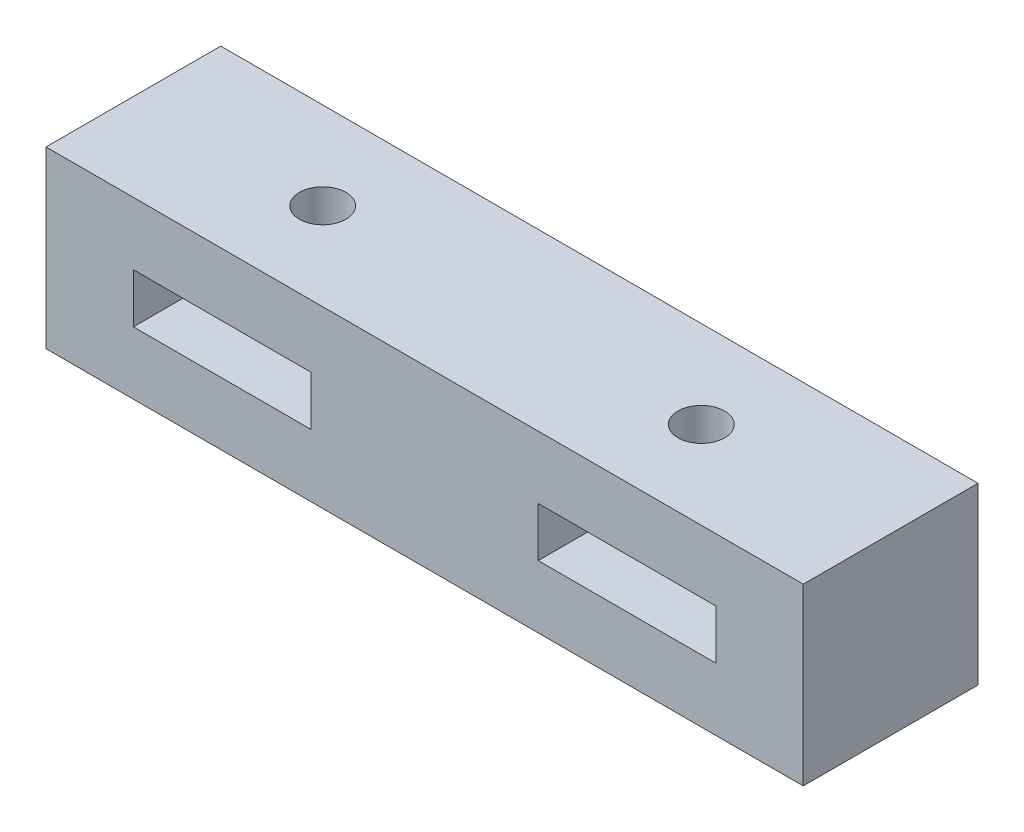
ISO-10303-21;
HEADER;
FILE_DESCRIPTION(('STEP AP214'),'2;1');
FILE_NAME('part.step','',(''),(''),'','','');
FILE_SCHEMA(('AUTOMOTIVE_DESIGN { 1 0 10303 214 1 1 1 1 }'));
ENDSEC;
DATA;
#1=APPLICATION_CONTEXT('core data for automotive mechanical design processes');
#2=APPLICATION_PROTOCOL_DEFINITION('international standard','automotive_design',2000,#1);
#3=PRODUCT_CONTEXT('',#1,'mechanical');
#4=PRODUCT('Part','Part','',(#3));
#5=PRODUCT_RELATED_PRODUCT_CATEGORY('part','',(#4));
#6=PRODUCT_DEFINITION_FORMATION('','',#4);
#7=PRODUCT_DEFINITION_CONTEXT('part definition',#1,'design');
#8=PRODUCT_DEFINITION('design','',#6,#7);
#9=PRODUCT_DEFINITION_SHAPE('','',#8);
#10=(LENGTH_UNIT() NAMED_UNIT(*) SI_UNIT(.MILLI.,.METRE.));
#11=(NAMED_UNIT(*) PLANE_ANGLE_UNIT() SI_UNIT($,.RADIAN.));
#12=(NAMED_UNIT(*) SI_UNIT($,.STERADIAN.) SOLID_ANGLE_UNIT());
#13=UNCERTAINTY_MEASURE_WITH_UNIT(LENGTH_MEASURE(1.E-05),#10,'distance_accuracy_value','');
#14=(GEOMETRIC_REPRESENTATION_CONTEXT(3) GLOBAL_UNCERTAINTY_ASSIGNED_CONTEXT((#13)) GLOBAL_UNIT_ASSIGNED_CONTEXT((#10,
#11,#12)) REPRESENTATION_CONTEXT('',''));
#15=CARTESIAN_POINT('',(0.,0.,0.));
#16=DIRECTION('',(0.,0.,1.));
#17=DIRECTION('',(1.,0.,0.));
#18=AXIS2_PLACEMENT_3D('',#15,#16,#17);
#19=CARTESIAN_POINT('',(0.,0.,6.));
#20=DIRECTION('',(0.,0.,-1.));
#21=DIRECTION('',(-1.,0.,0.));
#22=AXIS2_PLACEMENT_3D('',#19,#20,#21);
#23=PLANE('',#22);
#24=DIRECTION('',(0.,1.,0.));
#25=VECTOR('',#24,1.);
#26=CARTESIAN_POINT('',(-7.8,-1.7,6.));
#27=LINE('',#26,#25);
#28=CARTESIAN_POINT('',(-7.8,-1.7,6.));
#29=VERTEX_POINT('',#28);
#30=CARTESIAN_POINT('',(-7.8,1.7,6.));
#31=VERTEX_POINT('',#30);
#32=EDGE_CURVE('E166',#29,#31,#27,.T.);
#33=ORIENTED_EDGE('',*,*,#32,.F.);
#34=DIRECTION('',(1.,0.,0.));
#35=VECTOR('',#34,1.);
#36=CARTESIAN_POINT('',(-20.,-1.7,6.));
#37=LINE('',#36,#35);
#38=CARTESIAN_POINT('',(-20.,-1.7,6.));
#39=VERTEX_POINT('',#38);
#40=EDGE_CURVE('E174',#39,#29,#37,.T.);
#41=ORIENTED_EDGE('',*,*,#40,.F.);
#42=DIRECTION('',(0.,-1.,0.));
#43=VECTOR('',#42,1.);
#44=CARTESIAN_POINT('',(-20.,-1.7,6.));
#45=LINE('',#44,#43);
#46=CARTESIAN_POINT('',(-20.,1.7,6.));
#47=VERTEX_POINT('',#46);
#48=EDGE_CURVE('E171',#47,#39,#45,.T.);
#49=ORIENTED_EDGE('',*,*,#48,.F.);
#50=DIRECTION('',(-1.,0.,0.));
#51=VECTOR('',#50,1.);
#52=CARTESIAN_POINT('',(-20.,1.7,6.));
#53=LINE('',#52,#51);
#54=EDGE_CURVE('E168',#31,#47,#53,.T.);
#55=ORIENTED_EDGE('',*,*,#54,.F.);
#56=EDGE_LOOP('',(#33,#41,#49,#55));
#57=FACE_BOUND('',#56,.T.);
#58=DIRECTION('',(0.,1.,0.));
#59=VECTOR('',#58,1.);
#60=CARTESIAN_POINT('',(26.,-6.,6.));
#61=LINE('',#60,#59);
#62=CARTESIAN_POINT('',(26.,-6.,6.));
#63=VERTEX_POINT('',#62);
#64=CARTESIAN_POINT('',(26.,6.,6.));
#65=VERTEX_POINT('',#64);
#66=EDGE_CURVE('E197',#63,#65,#61,.T.);
#67=ORIENTED_EDGE('',*,*,#66,.T.);
#68=DIRECTION('',(-1.,0.,0.));
#69=VECTOR('',#68,1.);
#70=CARTESIAN_POINT('',(-26.,5.99999999999999,6.));
#71=LINE('',#70,#69);
#72=CARTESIAN_POINT('',(-26.,5.99999999999999,6.));
#73=VERTEX_POINT('',#72);
#74=EDGE_CURVE('E200',#65,#73,#71,.T.);
#75=ORIENTED_EDGE('',*,*,#74,.T.);
#76=DIRECTION('',(0.,-1.,0.));
#77=VECTOR('',#76,1.);
#78=CARTESIAN_POINT('',(-26.,-6.00000000000001,6.));
#79=LINE('',#78,#77);
#80=CARTESIAN_POINT('',(-26.,-6.00000000000001,6.));
#81=VERTEX_POINT('',#80);
#82=EDGE_CURVE('E203',#73,#81,#79,.T.);
#83=ORIENTED_EDGE('',*,*,#82,.T.);
#84=DIRECTION('',(1.,0.,0.));
#85=VECTOR('',#84,1.);
#86=CARTESIAN_POINT('',(-26.,-6.00000000000001,6.));
#87=LINE('',#86,#85);
#88=EDGE_CURVE('E205',#81,#63,#87,.T.);
#89=ORIENTED_EDGE('',*,*,#88,.T.);
#90=EDGE_LOOP('',(#67,#75,#83,#89));
#91=FACE_BOUND('',#90,.T.);
#92=DIRECTION('',(0.,1.,0.));
#93=VECTOR('',#92,1.);
#94=CARTESIAN_POINT('',(20.,-1.69999999999999,6.));
#95=LINE('',#94,#93);
#96=CARTESIAN_POINT('',(20.,-1.69999999999999,6.));
#97=VERTEX_POINT('',#96);
#98=CARTESIAN_POINT('',(20.,1.70000000000001,6.));
#99=VERTEX_POINT('',#98);
#100=EDGE_CURVE('E128',#97,#99,#95,.T.);
#101=ORIENTED_EDGE('',*,*,#100,.F.);
#102=DIRECTION('',(1.,0.,0.));
#103=VECTOR('',#102,1.);
#104=CARTESIAN_POINT('',(20.,-1.69999999999999,6.));
#105=LINE('',#104,#103);
#106=CARTESIAN_POINT('',(7.8,-1.7,6.));
#107=VERTEX_POINT('',#106);
#108=EDGE_CURVE('E150',#107,#97,#105,.T.);
#109=ORIENTED_EDGE('',*,*,#108,.F.);
#110=DIRECTION('',(0.,-1.,0.));
#111=VECTOR('',#110,1.);
#112=CARTESIAN_POINT('',(7.8,-1.7,6.));
#113=LINE('',#112,#111);
#114=CARTESIAN_POINT('',(7.8,1.7,6.));
#115=VERTEX_POINT('',#114);
#116=EDGE_CURVE('E148',#115,#107,#113,.T.);
#117=ORIENTED_EDGE('',*,*,#116,.F.);
#118=DIRECTION('',(-1.,0.,0.));
#119=VECTOR('',#118,1.);
#120=CARTESIAN_POINT('',(20.,1.70000000000001,6.));
#121=LINE('',#120,#119);
#122=EDGE_CURVE('E136',#99,#115,#121,.T.);
#123=ORIENTED_EDGE('',*,*,#122,.F.);
#124=EDGE_LOOP('',(#101,#109,#117,#123));
#125=FACE_BOUND('',#124,.T.);
#126=ADVANCED_FACE('F37',(#57,#91,#125),#23,.F.);
#127=CARTESIAN_POINT('',(0.,0.,-6.));
#128=DIRECTION('',(0.,0.,-1.));
#129=DIRECTION('',(-1.,0.,0.));
#130=AXIS2_PLACEMENT_3D('',#127,#128,#129);
#131=PLANE('',#130);
#132=CARTESIAN_POINT('',(0.,0.,-6.));
#133=DIRECTION('',(0.,0.,-1.));
#134=DIRECTION('',(-1.,0.,0.));
#135=AXIS2_PLACEMENT_3D('',#132,#133,#134);
#136=CIRCLE('',#135,4.15);
#137=CARTESIAN_POINT('',(-4.15,0.,-6.));
#138=VERTEX_POINT('',#137);
#139=EDGE_CURVE('E246',#138,#138,#136,.T.);
#140=ORIENTED_EDGE('',*,*,#139,.F.);
#141=EDGE_LOOP('',(#140));
#142=FACE_BOUND('',#141,.T.);
#143=DIRECTION('',(0.,1.,0.));
#144=VECTOR('',#143,1.);
#145=CARTESIAN_POINT('',(26.,-6.,-6.));
#146=LINE('',#145,#144);
#147=CARTESIAN_POINT('',(26.,-6.,-6.));
#148=VERTEX_POINT('',#147);
#149=CARTESIAN_POINT('',(26.,6.,-6.));
#150=VERTEX_POINT('',#149);
#151=EDGE_CURVE('E196',#148,#150,#146,.T.);
#152=ORIENTED_EDGE('',*,*,#151,.F.);
#153=DIRECTION('',(1.,0.,0.));
#154=VECTOR('',#153,1.);
#155=CARTESIAN_POINT('',(-26.,-6.00000000000001,-6.));
#156=LINE('',#155,#154);
#157=CARTESIAN_POINT('',(-26.,-6.00000000000001,-6.));
#158=VERTEX_POINT('',#157);
#159=EDGE_CURVE('E201',#158,#148,#156,.T.);
#160=ORIENTED_EDGE('',*,*,#159,.F.);
#161=DIRECTION('',(0.,-1.,0.));
#162=VECTOR('',#161,1.);
#163=CARTESIAN_POINT('',(-26.,-6.00000000000001,-6.));
#164=LINE('',#163,#162);
#165=CARTESIAN_POINT('',(-26.,5.99999999999999,-6.));
#166=VERTEX_POINT('',#165);
#167=EDGE_CURVE('E212',#166,#158,#164,.T.);
#168=ORIENTED_EDGE('',*,*,#167,.F.);
#169=DIRECTION('',(-1.,0.,0.));
#170=VECTOR('',#169,1.);
#171=CARTESIAN_POINT('',(-26.,5.99999999999999,-6.));
#172=LINE('',#171,#170);
#173=EDGE_CURVE('E210',#150,#166,#172,.T.);
#174=ORIENTED_EDGE('',*,*,#173,.F.);
#175=EDGE_LOOP('',(#152,#160,#168,#174));
#176=FACE_BOUND('',#175,.T.);
#177=DIRECTION('',(1.,0.,0.));
#178=VECTOR('',#177,1.);
#179=CARTESIAN_POINT('',(-20.,-1.7,-6.));
#180=LINE('',#179,#178);
#181=CARTESIAN_POINT('',(-20.,-1.7,-6.));
#182=VERTEX_POINT('',#181);
#183=CARTESIAN_POINT('',(-7.8,-1.7,-6.));
#184=VERTEX_POINT('',#183);
#185=EDGE_CURVE('E169',#182,#184,#180,.T.);
#186=ORIENTED_EDGE('',*,*,#185,.T.);
#187=DIRECTION('',(0.,1.,0.));
#188=VECTOR('',#187,1.);
#189=CARTESIAN_POINT('',(-7.8,-1.7,-6.));
#190=LINE('',#189,#188);
#191=CARTESIAN_POINT('',(-7.8,1.7,-6.));
#192=VERTEX_POINT('',#191);
#193=EDGE_CURVE('E144',#184,#192,#190,.T.);
#194=ORIENTED_EDGE('',*,*,#193,.T.);
#195=DIRECTION('',(-1.,0.,0.));
#196=VECTOR('',#195,1.);
#197=CARTESIAN_POINT('',(-20.,1.7,-6.));
#198=LINE('',#197,#196);
#199=CARTESIAN_POINT('',(-20.,1.7,-6.));
#200=VERTEX_POINT('',#199);
#201=EDGE_CURVE('E179',#192,#200,#198,.T.);
#202=ORIENTED_EDGE('',*,*,#201,.T.);
#203=DIRECTION('',(0.,-1.,0.));
#204=VECTOR('',#203,1.);
#205=CARTESIAN_POINT('',(-20.,-1.7,-6.));
#206=LINE('',#205,#204);
#207=EDGE_CURVE('E182',#200,#182,#206,.T.);
#208=ORIENTED_EDGE('',*,*,#207,.T.);
#209=EDGE_LOOP('',(#186,#194,#202,#208));
#210=FACE_BOUND('',#209,.T.);
#211=DIRECTION('',(1.,0.,0.));
#212=VECTOR('',#211,1.);
#213=CARTESIAN_POINT('',(20.,-1.69999999999999,-6.));
#214=LINE('',#213,#212);
#215=CARTESIAN_POINT('',(7.8,-1.7,-6.));
#216=VERTEX_POINT('',#215);
#217=CARTESIAN_POINT('',(20.,-1.69999999999999,-6.));
#218=VERTEX_POINT('',#217);
#219=EDGE_CURVE('E137',#216,#218,#214,.T.);
#220=ORIENTED_EDGE('',*,*,#219,.T.);
#221=DIRECTION('',(0.,1.,0.));
#222=VECTOR('',#221,1.);
#223=CARTESIAN_POINT('',(20.,-1.69999999999999,-6.));
#224=LINE('',#223,#222);
#225=CARTESIAN_POINT('',(20.,1.70000000000001,-6.));
#226=VERTEX_POINT('',#225);
#227=EDGE_CURVE('E62',#218,#226,#224,.T.);
#228=ORIENTED_EDGE('',*,*,#227,.T.);
#229=DIRECTION('',(-1.,0.,0.));
#230=VECTOR('',#229,1.);
#231=CARTESIAN_POINT('',(20.,1.70000000000001,-6.));
#232=LINE('',#231,#230);
#233=CARTESIAN_POINT('',(7.8,1.7,-6.));
#234=VERTEX_POINT('',#233);
#235=EDGE_CURVE('E143',#226,#234,#232,.T.);
#236=ORIENTED_EDGE('',*,*,#235,.T.);
#237=DIRECTION('',(0.,-1.,0.));
#238=VECTOR('',#237,1.);
#239=CARTESIAN_POINT('',(7.8,-1.7,-6.));
#240=LINE('',#239,#238);
#241=EDGE_CURVE('E158',#234,#216,#240,.T.);
#242=ORIENTED_EDGE('',*,*,#241,.T.);
#243=EDGE_LOOP('',(#220,#228,#236,#242));
#244=FACE_BOUND('',#243,.T.);
#245=ADVANCED_FACE('F253',(#142,#176,#210,#244),#131,.T.);
#246=CARTESIAN_POINT('',(26.,-6.,6.));
#247=DIRECTION('',(-1.,0.,0.));
#248=DIRECTION('',(0.,-1.,0.));
#249=AXIS2_PLACEMENT_3D('',#246,#247,#248);
#250=PLANE('',#249);
#251=ORIENTED_EDGE('',*,*,#151,.T.);
#252=DIRECTION('',(0.,0.,-1.));
#253=VECTOR('',#252,1.);
#254=CARTESIAN_POINT('',(26.,6.,6.));
#255=LINE('',#254,#253);
#256=EDGE_CURVE('E11',#65,#150,#255,.T.);
#257=ORIENTED_EDGE('',*,*,#256,.F.);
#258=ORIENTED_EDGE('',*,*,#66,.F.);
#259=DIRECTION('',(0.,0.,-1.));
#260=VECTOR('',#259,1.);
#261=CARTESIAN_POINT('',(26.,-6.,6.));
#262=LINE('',#261,#260);
#263=EDGE_CURVE('E207',#63,#148,#262,.T.);
#264=ORIENTED_EDGE('',*,*,#263,.T.);
#265=EDGE_LOOP('',(#251,#257,#258,#264));
#266=FACE_BOUND('',#265,.T.);
#267=ADVANCED_FACE('F39',(#266),#250,.F.);
#268=CARTESIAN_POINT('',(-26.,5.99999999999999,6.));
#269=DIRECTION('',(0.,-1.,0.));
#270=DIRECTION('',(1.,0.,0.));
#271=AXIS2_PLACEMENT_3D('',#268,#269,#270);
#272=PLANE('',#271);
#273=CARTESIAN_POINT('',(-13.,6.,0.));
#274=DIRECTION('',(0.,1.,0.));
#275=DIRECTION('',(-1.,0.,0.));
#276=AXIS2_PLACEMENT_3D('',#273,#274,#275);
#277=CIRCLE('',#276,1.6);
#278=CARTESIAN_POINT('',(-14.6,6.,0.));
#279=VERTEX_POINT('',#278);
#280=EDGE_CURVE('E224',#279,#279,#277,.T.);
#281=ORIENTED_EDGE('',*,*,#280,.F.);
#282=EDGE_LOOP('',(#281));
#283=FACE_BOUND('',#282,.T.);
#284=CARTESIAN_POINT('',(13.,6.,0.));
#285=DIRECTION('',(0.,1.,0.));
#286=DIRECTION('',(1.,0.,0.));
#287=AXIS2_PLACEMENT_3D('',#284,#285,#286);
#288=CIRCLE('',#287,1.6);
#289=CARTESIAN_POINT('',(14.6,6.,0.));
#290=VERTEX_POINT('',#289);
#291=EDGE_CURVE('E231',#290,#290,#288,.T.);
#292=ORIENTED_EDGE('',*,*,#291,.F.);
#293=EDGE_LOOP('',(#292));
#294=FACE_BOUND('',#293,.T.);
#295=ORIENTED_EDGE('',*,*,#173,.T.);
#296=DIRECTION('',(0.,0.,-1.));
#297=VECTOR('',#296,1.);
#298=CARTESIAN_POINT('',(-26.,5.99999999999999,6.));
#299=LINE('',#298,#297);
#300=EDGE_CURVE('E46',#73,#166,#299,.T.);
#301=ORIENTED_EDGE('',*,*,#300,.F.);
#302=ORIENTED_EDGE('',*,*,#74,.F.);
#303=ORIENTED_EDGE('',*,*,#256,.T.);
#304=EDGE_LOOP('',(#295,#301,#302,#303));
#305=FACE_BOUND('',#304,.T.);
#306=ADVANCED_FACE('F294',(#283,#294,#305),#272,.F.);
#307=CARTESIAN_POINT('',(-26.,-6.00000000000001,6.));
#308=DIRECTION('',(1.,0.,0.));
#309=DIRECTION('',(0.,1.,0.));
#310=AXIS2_PLACEMENT_3D('',#307,#308,#309);
#311=PLANE('',#310);
#312=ORIENTED_EDGE('',*,*,#167,.T.);
#313=DIRECTION('',(0.,0.,-1.));
#314=VECTOR('',#313,1.);
#315=CARTESIAN_POINT('',(-26.,-6.00000000000001,6.));
#316=LINE('',#315,#314);
#317=EDGE_CURVE('E217',#81,#158,#316,.T.);
#318=ORIENTED_EDGE('',*,*,#317,.F.);
#319=ORIENTED_EDGE('',*,*,#82,.F.);
#320=ORIENTED_EDGE('',*,*,#300,.T.);
#321=EDGE_LOOP('',(#312,#318,#319,#320));
#322=FACE_BOUND('',#321,.T.);
#323=ADVANCED_FACE('F291',(#322),#311,.F.);
#324=CARTESIAN_POINT('',(-26.,-6.00000000000001,6.));
#325=DIRECTION('',(0.,1.,0.));
#326=DIRECTION('',(-1.,0.,0.));
#327=AXIS2_PLACEMENT_3D('',#324,#325,#326);
#328=PLANE('',#327);
#329=CARTESIAN_POINT('',(-13.,-6.00000000000001,0.));
#330=DIRECTION('',(0.,1.,0.));
#331=DIRECTION('',(-1.,0.,0.));
#332=AXIS2_PLACEMENT_3D('',#329,#330,#331);
#333=CIRCLE('',#332,1.6);
#334=CARTESIAN_POINT('',(-14.6,-6.00000000000001,0.));
#335=VERTEX_POINT('',#334);
#336=EDGE_CURVE('E243',#335,#335,#333,.T.);
#337=ORIENTED_EDGE('',*,*,#336,.T.);
#338=EDGE_LOOP('',(#337));
#339=FACE_BOUND('',#338,.T.);
#340=CARTESIAN_POINT('',(13.,-6.,0.));
#341=DIRECTION('',(0.,1.,0.));
#342=DIRECTION('',(-1.,0.,0.));
#343=AXIS2_PLACEMENT_3D('',#340,#341,#342);
#344=CIRCLE('',#343,1.6);
#345=CARTESIAN_POINT('',(11.4,-6.,0.));
#346=VERTEX_POINT('',#345);
#347=EDGE_CURVE('E228',#346,#346,#344,.T.);
#348=ORIENTED_EDGE('',*,*,#347,.T.);
#349=EDGE_LOOP('',(#348));
#350=FACE_BOUND('',#349,.T.);
#351=ORIENTED_EDGE('',*,*,#159,.T.);
#352=ORIENTED_EDGE('',*,*,#263,.F.);
#353=ORIENTED_EDGE('',*,*,#88,.F.);
#354=ORIENTED_EDGE('',*,*,#317,.T.);
#355=EDGE_LOOP('',(#351,#352,#353,#354));
#356=FACE_BOUND('',#355,.T.);
#357=ADVANCED_FACE('F288',(#339,#350,#356),#328,.F.);
#358=CARTESIAN_POINT('',(-7.8,-1.7,6.));
#359=DIRECTION('',(-1.,0.,0.));
#360=DIRECTION('',(0.,0.,1.));
#361=AXIS2_PLACEMENT_3D('',#358,#359,#360);
#362=PLANE('',#361);
#363=ORIENTED_EDGE('',*,*,#193,.F.);
#364=DIRECTION('',(0.,0.,-1.));
#365=VECTOR('',#364,1.);
#366=CARTESIAN_POINT('',(-7.8,-1.7,6.));
#367=LINE('',#366,#365);
#368=EDGE_CURVE('E176',#29,#184,#367,.T.);
#369=ORIENTED_EDGE('',*,*,#368,.F.);
#370=ORIENTED_EDGE('',*,*,#32,.T.);
#371=DIRECTION('',(0.,0.,-1.));
#372=VECTOR('',#371,1.);
#373=CARTESIAN_POINT('',(-7.8,1.7,6.));
#374=LINE('',#373,#372);
#375=EDGE_CURVE('E193',#31,#192,#374,.T.);
#376=ORIENTED_EDGE('',*,*,#375,.T.);
#377=EDGE_LOOP('',(#363,#369,#370,#376));
#378=FACE_BOUND('',#377,.T.);
#379=ADVANCED_FACE('F285',(#378),#362,.T.);
#380=CARTESIAN_POINT('',(-20.,1.7,6.));
#381=DIRECTION('',(0.,-1.,0.));
#382=DIRECTION('',(0.,0.,-1.));
#383=AXIS2_PLACEMENT_3D('',#380,#381,#382);
#384=PLANE('',#383);
#385=CARTESIAN_POINT('',(-13.,1.7,0.));
#386=DIRECTION('',(0.,-1.,0.));
#387=DIRECTION('',(0.,0.,-1.));
#388=AXIS2_PLACEMENT_3D('',#385,#386,#387);
#389=CIRCLE('',#388,1.6);
#390=CARTESIAN_POINT('',(-13.,1.7,-1.60000000000001));
#391=VERTEX_POINT('',#390);
#392=EDGE_CURVE('E240',#391,#391,#389,.T.);
#393=ORIENTED_EDGE('',*,*,#392,.F.);
#394=EDGE_LOOP('',(#393));
#395=FACE_BOUND('',#394,.T.);
#396=ORIENTED_EDGE('',*,*,#201,.F.);
#397=ORIENTED_EDGE('',*,*,#375,.F.);
#398=ORIENTED_EDGE('',*,*,#54,.T.);
#399=DIRECTION('',(0.,0.,-1.));
#400=VECTOR('',#399,1.);
#401=CARTESIAN_POINT('',(-20.,1.7,6.));
#402=LINE('',#401,#400);
#403=EDGE_CURVE('E191',#47,#200,#402,.T.);
#404=ORIENTED_EDGE('',*,*,#403,.T.);
#405=EDGE_LOOP('',(#396,#397,#398,#404));
#406=FACE_BOUND('',#405,.T.);
#407=ADVANCED_FACE('F367',(#395,#406),#384,.T.);
#408=CARTESIAN_POINT('',(-20.,-1.7,6.));
#409=DIRECTION('',(1.,0.,0.));
#410=DIRECTION('',(0.,0.,-1.));
#411=AXIS2_PLACEMENT_3D('',#408,#409,#410);
#412=PLANE('',#411);
#413=ORIENTED_EDGE('',*,*,#207,.F.);
#414=ORIENTED_EDGE('',*,*,#403,.F.);
#415=ORIENTED_EDGE('',*,*,#48,.T.);
#416=DIRECTION('',(0.,0.,-1.));
#417=VECTOR('',#416,1.);
#418=CARTESIAN_POINT('',(-20.,-1.7,6.));
#419=LINE('',#418,#417);
#420=EDGE_CURVE('E189',#39,#182,#419,.T.);
#421=ORIENTED_EDGE('',*,*,#420,.T.);
#422=EDGE_LOOP('',(#413,#414,#415,#421));
#423=FACE_BOUND('',#422,.T.);
#424=ADVANCED_FACE('F370',(#423),#412,.T.);
#425=CARTESIAN_POINT('',(-20.,-1.7,6.));
#426=DIRECTION('',(0.,1.,0.));
#427=DIRECTION('',(0.,0.,1.));
#428=AXIS2_PLACEMENT_3D('',#425,#426,#427);
#429=PLANE('',#428);
#430=CARTESIAN_POINT('',(-13.,-1.7,0.));
#431=DIRECTION('',(0.,1.,0.));
#432=DIRECTION('',(0.,0.,1.));
#433=AXIS2_PLACEMENT_3D('',#430,#431,#432);
#434=CIRCLE('',#433,1.6);
#435=CARTESIAN_POINT('',(-13.,-1.7,1.6));
#436=VERTEX_POINT('',#435);
#437=EDGE_CURVE('E41',#436,#436,#434,.T.);
#438=ORIENTED_EDGE('',*,*,#437,.F.);
#439=EDGE_LOOP('',(#438));
#440=FACE_BOUND('',#439,.T.);
#441=ORIENTED_EDGE('',*,*,#185,.F.);
#442=ORIENTED_EDGE('',*,*,#420,.F.);
#443=ORIENTED_EDGE('',*,*,#40,.T.);
#444=ORIENTED_EDGE('',*,*,#368,.T.);
#445=EDGE_LOOP('',(#441,#442,#443,#444));
#446=FACE_BOUND('',#445,.T.);
#447=ADVANCED_FACE('F381',(#440,#446),#429,.T.);
#448=CARTESIAN_POINT('',(20.,-1.69999999999999,6.));
#449=DIRECTION('',(-1.,0.,0.));
#450=DIRECTION('',(0.,0.,1.));
#451=AXIS2_PLACEMENT_3D('',#448,#449,#450);
#452=PLANE('',#451);
#453=ORIENTED_EDGE('',*,*,#227,.F.);
#454=DIRECTION('',(0.,0.,-1.));
#455=VECTOR('',#454,1.);
#456=CARTESIAN_POINT('',(20.,-1.69999999999999,6.));
#457=LINE('',#456,#455);
#458=EDGE_CURVE('E132',#97,#218,#457,.T.);
#459=ORIENTED_EDGE('',*,*,#458,.F.);
#460=ORIENTED_EDGE('',*,*,#100,.T.);
#461=DIRECTION('',(0.,0.,-1.));
#462=VECTOR('',#461,1.);
#463=CARTESIAN_POINT('',(20.,1.70000000000001,6.));
#464=LINE('',#463,#462);
#465=EDGE_CURVE('E131',#99,#226,#464,.T.);
#466=ORIENTED_EDGE('',*,*,#465,.T.);
#467=EDGE_LOOP('',(#453,#459,#460,#466));
#468=FACE_BOUND('',#467,.T.);
#469=ADVANCED_FACE('F130',(#468),#452,.T.);
#470=CARTESIAN_POINT('',(20.,1.70000000000001,6.));
#471=DIRECTION('',(0.,-1.,0.));
#472=DIRECTION('',(1.,0.,0.));
#473=AXIS2_PLACEMENT_3D('',#470,#471,#472);
#474=PLANE('',#473);
#475=CARTESIAN_POINT('',(13.,1.7,0.));
#476=DIRECTION('',(0.,-1.,0.));
#477=DIRECTION('',(1.,0.,0.));
#478=AXIS2_PLACEMENT_3D('',#475,#476,#477);
#479=CIRCLE('',#478,1.6);
#480=CARTESIAN_POINT('',(14.6,1.7,0.));
#481=VERTEX_POINT('',#480);
#482=EDGE_CURVE('E223',#481,#481,#479,.T.);
#483=ORIENTED_EDGE('',*,*,#482,.F.);
#484=EDGE_LOOP('',(#483));
#485=FACE_BOUND('',#484,.T.);
#486=ORIENTED_EDGE('',*,*,#235,.F.);
#487=ORIENTED_EDGE('',*,*,#465,.F.);
#488=ORIENTED_EDGE('',*,*,#122,.T.);
#489=DIRECTION('',(0.,0.,-1.));
#490=VECTOR('',#489,1.);
#491=CARTESIAN_POINT('',(7.8,1.7,6.));
#492=LINE('',#491,#490);
#493=EDGE_CURVE('E145',#115,#234,#492,.T.);
#494=ORIENTED_EDGE('',*,*,#493,.T.);
#495=EDGE_LOOP('',(#486,#487,#488,#494));
#496=FACE_BOUND('',#495,.T.);
#497=ADVANCED_FACE('F140',(#485,#496),#474,.T.);
#498=CARTESIAN_POINT('',(7.8,-1.7,6.));
#499=DIRECTION('',(1.,0.,0.));
#500=DIRECTION('',(0.,0.,-1.));
#501=AXIS2_PLACEMENT_3D('',#498,#499,#500);
#502=PLANE('',#501);
#503=ORIENTED_EDGE('',*,*,#241,.F.);
#504=ORIENTED_EDGE('',*,*,#493,.F.);
#505=ORIENTED_EDGE('',*,*,#116,.T.);
#506=DIRECTION('',(0.,0.,-1.));
#507=VECTOR('',#506,1.);
#508=CARTESIAN_POINT('',(7.8,-1.7,6.));
#509=LINE('',#508,#507);
#510=EDGE_CURVE('E54',#107,#216,#509,.T.);
#511=ORIENTED_EDGE('',*,*,#510,.T.);
#512=EDGE_LOOP('',(#503,#504,#505,#511));
#513=FACE_BOUND('',#512,.T.);
#514=ADVANCED_FACE('F265',(#513),#502,.T.);
#515=CARTESIAN_POINT('',(20.,-1.69999999999999,6.));
#516=DIRECTION('',(0.,1.,0.));
#517=DIRECTION('',(-1.,0.,0.));
#518=AXIS2_PLACEMENT_3D('',#515,#516,#517);
#519=PLANE('',#518);
#520=CARTESIAN_POINT('',(13.,-1.7,0.));
#521=DIRECTION('',(0.,1.,0.));
#522=DIRECTION('',(-1.,0.,0.));
#523=AXIS2_PLACEMENT_3D('',#520,#521,#522);
#524=CIRCLE('',#523,1.6);
#525=CARTESIAN_POINT('',(11.4,-1.7,0.));
#526=VERTEX_POINT('',#525);
#527=EDGE_CURVE('E221',#526,#526,#524,.T.);
#528=ORIENTED_EDGE('',*,*,#527,.F.);
#529=EDGE_LOOP('',(#528));
#530=FACE_BOUND('',#529,.T.);
#531=ORIENTED_EDGE('',*,*,#219,.F.);
#532=ORIENTED_EDGE('',*,*,#510,.F.);
#533=ORIENTED_EDGE('',*,*,#108,.T.);
#534=ORIENTED_EDGE('',*,*,#458,.T.);
#535=EDGE_LOOP('',(#531,#532,#533,#534));
#536=FACE_BOUND('',#535,.T.);
#537=ADVANCED_FACE('F263',(#530,#536),#519,.T.);
#538=CARTESIAN_POINT('',(0.,0.,3.));
#539=DIRECTION('',(0.,0.,-1.));
#540=DIRECTION('',(-1.,0.,0.));
#541=AXIS2_PLACEMENT_3D('',#538,#539,#540);
#542=CYLINDRICAL_SURFACE('',#541,4.15);
#543=CARTESIAN_POINT('',(0.,0.,3.));
#544=DIRECTION('',(0.,0.,-1.));
#545=DIRECTION('',(-1.,0.,0.));
#546=AXIS2_PLACEMENT_3D('',#543,#544,#545);
#547=CIRCLE('',#546,4.15);
#548=CARTESIAN_POINT('',(-4.15,0.,3.));
#549=VERTEX_POINT('',#548);
#550=EDGE_CURVE('E156',#549,#549,#547,.T.);
#551=ORIENTED_EDGE('',*,*,#550,.F.);
#552=EDGE_LOOP('',(#551));
#553=FACE_BOUND('',#552,.T.);
#554=ORIENTED_EDGE('',*,*,#139,.T.);
#555=EDGE_LOOP('',(#554));
#556=FACE_BOUND('',#555,.T.);
#557=ADVANCED_FACE('F251',(#553,#556),#542,.F.);
#558=CARTESIAN_POINT('',(0.,0.,3.));
#559=DIRECTION('',(0.,0.,-1.));
#560=DIRECTION('',(-1.,0.,0.));
#561=AXIS2_PLACEMENT_3D('',#558,#559,#560);
#562=PLANE('',#561);
#563=ORIENTED_EDGE('',*,*,#550,.T.);
#564=EDGE_LOOP('',(#563));
#565=FACE_BOUND('',#564,.T.);
#566=ADVANCED_FACE('F272',(#565),#562,.T.);
#567=CARTESIAN_POINT('',(13.,-24.,0.));
#568=DIRECTION('',(0.,1.,0.));
#569=DIRECTION('',(-1.,0.,0.));
#570=AXIS2_PLACEMENT_3D('',#567,#568,#569);
#571=CYLINDRICAL_SURFACE('',#570,1.6);
#572=ORIENTED_EDGE('',*,*,#527,.T.);
#573=EDGE_LOOP('',(#572));
#574=FACE_BOUND('',#573,.T.);
#575=ORIENTED_EDGE('',*,*,#347,.F.);
#576=EDGE_LOOP('',(#575));
#577=FACE_BOUND('',#576,.T.);
#578=ADVANCED_FACE('F318',(#574,#577),#571,.F.);
#579=ORIENTED_EDGE('',*,*,#482,.T.);
#580=EDGE_LOOP('',(#579));
#581=FACE_BOUND('',#580,.T.);
#582=ORIENTED_EDGE('',*,*,#291,.T.);
#583=EDGE_LOOP('',(#582));
#584=FACE_BOUND('',#583,.T.);
#585=ADVANCED_FACE('F315',(#581,#584),#571,.F.);
#586=CARTESIAN_POINT('',(-13.,-24.,0.));
#587=DIRECTION('',(0.,1.,0.));
#588=DIRECTION('',(-1.,0.,0.));
#589=AXIS2_PLACEMENT_3D('',#586,#587,#588);
#590=CYLINDRICAL_SURFACE('',#589,1.6);
#591=ORIENTED_EDGE('',*,*,#437,.T.);
#592=EDGE_LOOP('',(#591));
#593=FACE_BOUND('',#592,.T.);
#594=ORIENTED_EDGE('',*,*,#336,.F.);
#595=EDGE_LOOP('',(#594));
#596=FACE_BOUND('',#595,.T.);
#597=ADVANCED_FACE('F317',(#593,#596),#590,.F.);
#598=ORIENTED_EDGE('',*,*,#392,.T.);
#599=EDGE_LOOP('',(#598));
#600=FACE_BOUND('',#599,.T.);
#601=ORIENTED_EDGE('',*,*,#280,.T.);
#602=EDGE_LOOP('',(#601));
#603=FACE_BOUND('',#602,.T.);
#604=ADVANCED_FACE('F325',(#600,#603),#590,.F.);
#605=CLOSED_SHELL('',(#126,#245,#267,#306,#323,#357,#379,#407,#424,#447,#469,#497,#514,#537,
#557,#566,#578,#585,#597,#604));
#606=MANIFOLD_SOLID_BREP('B2',#605);
#607=ADVANCED_BREP_SHAPE_REPRESENTATION('',(#18,#606),#14);
#608=SHAPE_DEFINITION_REPRESENTATION(#9,#607);
ENDSEC;
END-ISO-10303-21;
